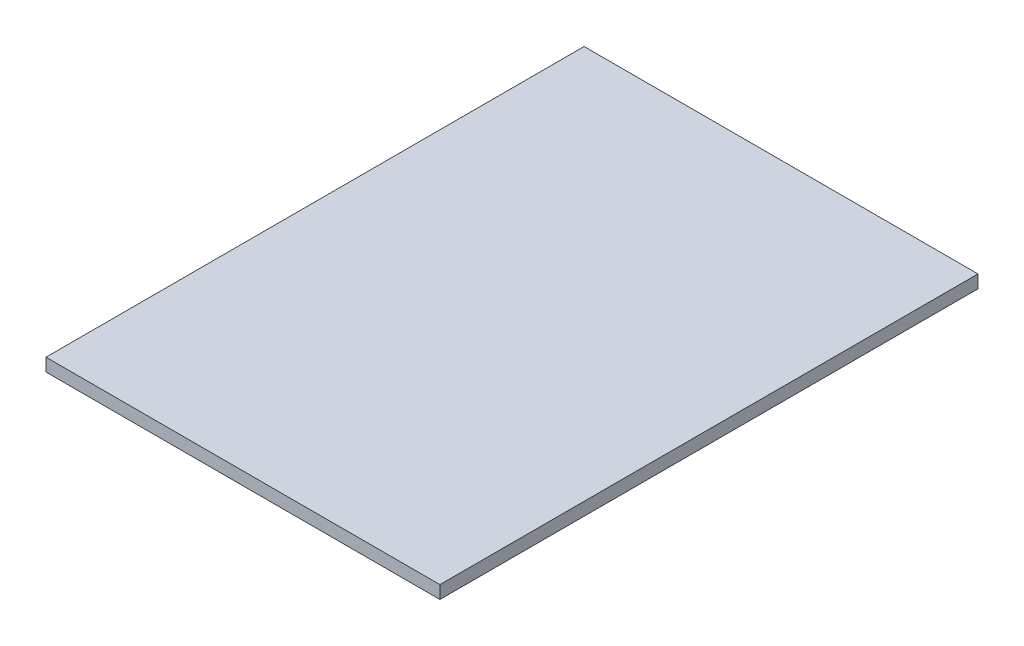
ISO-10303-21;
HEADER;
FILE_DESCRIPTION(('STEP AP214'),'2;1');
FILE_NAME('part.step','',(''),(''),'','','');
FILE_SCHEMA(('AUTOMOTIVE_DESIGN { 1 0 10303 214 1 1 1 1 }'));
ENDSEC;
DATA;
#1=APPLICATION_CONTEXT('core data for automotive mechanical design processes');
#2=APPLICATION_PROTOCOL_DEFINITION('international standard','automotive_design',2000,#1);
#3=PRODUCT_CONTEXT('',#1,'mechanical');
#4=PRODUCT('Part','Part','',(#3));
#5=PRODUCT_RELATED_PRODUCT_CATEGORY('part','',(#4));
#6=PRODUCT_DEFINITION_FORMATION('','',#4);
#7=PRODUCT_DEFINITION_CONTEXT('part definition',#1,'design');
#8=PRODUCT_DEFINITION('design','',#6,#7);
#9=PRODUCT_DEFINITION_SHAPE('','',#8);
#10=(LENGTH_UNIT() NAMED_UNIT(*) SI_UNIT(.MILLI.,.METRE.));
#11=(NAMED_UNIT(*) PLANE_ANGLE_UNIT() SI_UNIT($,.RADIAN.));
#12=(NAMED_UNIT(*) SI_UNIT($,.STERADIAN.) SOLID_ANGLE_UNIT());
#13=UNCERTAINTY_MEASURE_WITH_UNIT(LENGTH_MEASURE(1.E-05),#10,'distance_accuracy_value','');
#14=(GEOMETRIC_REPRESENTATION_CONTEXT(3) GLOBAL_UNCERTAINTY_ASSIGNED_CONTEXT((#13)) GLOBAL_UNIT_ASSIGNED_CONTEXT((#10,
#11,#12)) REPRESENTATION_CONTEXT('',''));
#15=CARTESIAN_POINT('',(0.,0.,0.));
#16=DIRECTION('',(0.,0.,1.));
#17=DIRECTION('',(1.,0.,0.));
#18=AXIS2_PLACEMENT_3D('',#15,#16,#17);
#19=CARTESIAN_POINT('',(0.,4.,0.));
#20=DIRECTION('',(-1.,0.,0.));
#21=DIRECTION('',(0.,0.,1.));
#22=AXIS2_PLACEMENT_3D('',#19,#20,#21);
#23=PLANE('',#22);
#24=DIRECTION('',(0.,0.,-1.));
#25=VECTOR('',#24,1.);
#26=CARTESIAN_POINT('',(0.,0.,0.));
#27=LINE('',#26,#25);
#28=CARTESIAN_POINT('',(0.,0.,-19.));
#29=VERTEX_POINT('',#28);
#30=CARTESIAN_POINT('',(0.,0.,-185.8));
#31=VERTEX_POINT('',#30);
#32=EDGE_CURVE('E92',#29,#31,#27,.T.);
#33=ORIENTED_EDGE('',*,*,#32,.F.);
#34=DIRECTION('',(0.,1.,0.));
#35=VECTOR('',#34,1.);
#36=CARTESIAN_POINT('',(0.,4.,-19.));
#37=LINE('',#36,#35);
#38=CARTESIAN_POINT('',(0.,4.,-19.));
#39=VERTEX_POINT('',#38);
#40=EDGE_CURVE('E53',#29,#39,#37,.T.);
#41=ORIENTED_EDGE('',*,*,#40,.T.);
#42=DIRECTION('',(0.,0.,-1.));
#43=VECTOR('',#42,1.);
#44=CARTESIAN_POINT('',(0.,4.,0.));
#45=LINE('',#44,#43);
#46=CARTESIAN_POINT('',(0.,4.,-185.8));
#47=VERTEX_POINT('',#46);
#48=EDGE_CURVE('E91',#39,#47,#45,.T.);
#49=ORIENTED_EDGE('',*,*,#48,.T.);
#50=DIRECTION('',(0.,-1.,0.));
#51=VECTOR('',#50,1.);
#52=CARTESIAN_POINT('',(0.,4.,-185.8));
#53=LINE('',#52,#51);
#54=EDGE_CURVE('E108',#47,#31,#53,.T.);
#55=ORIENTED_EDGE('',*,*,#54,.T.);
#56=EDGE_LOOP('',(#33,#41,#49,#55));
#57=FACE_BOUND('',#56,.T.);
#58=ADVANCED_FACE('F38',(#57),#23,.T.);
#59=CARTESIAN_POINT('',(122.1,4.,0.));
#60=DIRECTION('',(-1.,0.,0.));
#61=DIRECTION('',(0.,0.,1.));
#62=AXIS2_PLACEMENT_3D('',#59,#60,#61);
#63=PLANE('',#62);
#64=DIRECTION('',(0.,1.,0.));
#65=VECTOR('',#64,1.);
#66=CARTESIAN_POINT('',(122.1,4.,-19.));
#67=LINE('',#66,#65);
#68=CARTESIAN_POINT('',(122.1,0.,-19.));
#69=VERTEX_POINT('',#68);
#70=CARTESIAN_POINT('',(122.1,4.,-19.));
#71=VERTEX_POINT('',#70);
#72=EDGE_CURVE('E78',#69,#71,#67,.T.);
#73=ORIENTED_EDGE('',*,*,#72,.F.);
#74=DIRECTION('',(0.,0.,-1.));
#75=VECTOR('',#74,1.);
#76=CARTESIAN_POINT('',(122.1,0.,0.));
#77=LINE('',#76,#75);
#78=CARTESIAN_POINT('',(122.1,0.,-185.8));
#79=VERTEX_POINT('',#78);
#80=EDGE_CURVE('E60',#69,#79,#77,.T.);
#81=ORIENTED_EDGE('',*,*,#80,.T.);
#82=DIRECTION('',(0.,-1.,0.));
#83=VECTOR('',#82,1.);
#84=CARTESIAN_POINT('',(122.1,4.,-185.8));
#85=LINE('',#84,#83);
#86=CARTESIAN_POINT('',(122.1,4.,-185.8));
#87=VERTEX_POINT('',#86);
#88=EDGE_CURVE('E112',#87,#79,#85,.T.);
#89=ORIENTED_EDGE('',*,*,#88,.F.);
#90=DIRECTION('',(0.,0.,-1.));
#91=VECTOR('',#90,1.);
#92=CARTESIAN_POINT('',(122.1,4.,0.));
#93=LINE('',#92,#91);
#94=EDGE_CURVE('E84',#71,#87,#93,.T.);
#95=ORIENTED_EDGE('',*,*,#94,.F.);
#96=EDGE_LOOP('',(#73,#81,#89,#95));
#97=FACE_BOUND('',#96,.T.);
#98=ADVANCED_FACE('F83',(#97),#63,.F.);
#99=CARTESIAN_POINT('',(0.,4.,0.));
#100=DIRECTION('',(0.,-1.,0.));
#101=DIRECTION('',(0.,0.,-1.));
#102=AXIS2_PLACEMENT_3D('',#99,#100,#101);
#103=PLANE('',#102);
#104=DIRECTION('',(-1.,0.,0.));
#105=VECTOR('',#104,1.);
#106=CARTESIAN_POINT('',(0.,4.,-19.));
#107=LINE('',#106,#105);
#108=EDGE_CURVE('E115',#71,#39,#107,.T.);
#109=ORIENTED_EDGE('',*,*,#108,.F.);
#110=ORIENTED_EDGE('',*,*,#94,.T.);
#111=DIRECTION('',(1.,0.,0.));
#112=VECTOR('',#111,1.);
#113=CARTESIAN_POINT('',(0.,4.,-185.8));
#114=LINE('',#113,#112);
#115=EDGE_CURVE('E97',#47,#87,#114,.T.);
#116=ORIENTED_EDGE('',*,*,#115,.F.);
#117=ORIENTED_EDGE('',*,*,#48,.F.);
#118=EDGE_LOOP('',(#109,#110,#116,#117));
#119=FACE_BOUND('',#118,.T.);
#120=ADVANCED_FACE('F122',(#119),#103,.F.);
#121=CARTESIAN_POINT('',(0.,0.,0.));
#122=DIRECTION('',(0.,-1.,0.));
#123=DIRECTION('',(0.,0.,-1.));
#124=AXIS2_PLACEMENT_3D('',#121,#122,#123);
#125=PLANE('',#124);
#126=ORIENTED_EDGE('',*,*,#80,.F.);
#127=DIRECTION('',(-1.,0.,0.));
#128=VECTOR('',#127,1.);
#129=CARTESIAN_POINT('',(0.,0.,-19.));
#130=LINE('',#129,#128);
#131=EDGE_CURVE('E11',#69,#29,#130,.T.);
#132=ORIENTED_EDGE('',*,*,#131,.T.);
#133=ORIENTED_EDGE('',*,*,#32,.T.);
#134=DIRECTION('',(1.,0.,0.));
#135=VECTOR('',#134,1.);
#136=CARTESIAN_POINT('',(0.,0.,-185.8));
#137=LINE('',#136,#135);
#138=EDGE_CURVE('E46',#31,#79,#137,.T.);
#139=ORIENTED_EDGE('',*,*,#138,.T.);
#140=EDGE_LOOP('',(#126,#132,#133,#139));
#141=FACE_BOUND('',#140,.T.);
#142=ADVANCED_FACE('F88',(#141),#125,.T.);
#143=CARTESIAN_POINT('',(0.,0.,-185.8));
#144=DIRECTION('',(0.,0.,-1.));
#145=DIRECTION('',(-1.,0.,0.));
#146=AXIS2_PLACEMENT_3D('',#143,#144,#145);
#147=PLANE('',#146);
#148=ORIENTED_EDGE('',*,*,#115,.T.);
#149=ORIENTED_EDGE('',*,*,#88,.T.);
#150=ORIENTED_EDGE('',*,*,#138,.F.);
#151=ORIENTED_EDGE('',*,*,#54,.F.);
#152=EDGE_LOOP('',(#148,#149,#150,#151));
#153=FACE_BOUND('',#152,.T.);
#154=ADVANCED_FACE('F124',(#153),#147,.T.);
#155=CARTESIAN_POINT('',(0.,0.,-19.));
#156=DIRECTION('',(0.,0.,1.));
#157=DIRECTION('',(1.,0.,0.));
#158=AXIS2_PLACEMENT_3D('',#155,#156,#157);
#159=PLANE('',#158);
#160=ORIENTED_EDGE('',*,*,#108,.T.);
#161=ORIENTED_EDGE('',*,*,#40,.F.);
#162=ORIENTED_EDGE('',*,*,#131,.F.);
#163=ORIENTED_EDGE('',*,*,#72,.T.);
#164=EDGE_LOOP('',(#160,#161,#162,#163));
#165=FACE_BOUND('',#164,.T.);
#166=ADVANCED_FACE('F77',(#165),#159,.T.);
#167=CLOSED_SHELL('',(#58,#98,#120,#142,#154,#166));
#168=MANIFOLD_SOLID_BREP('B2',#167);
#169=ADVANCED_BREP_SHAPE_REPRESENTATION('',(#18,#168),#14);
#170=SHAPE_DEFINITION_REPRESENTATION(#9,#169);
ENDSEC;
END-ISO-10303-21;
